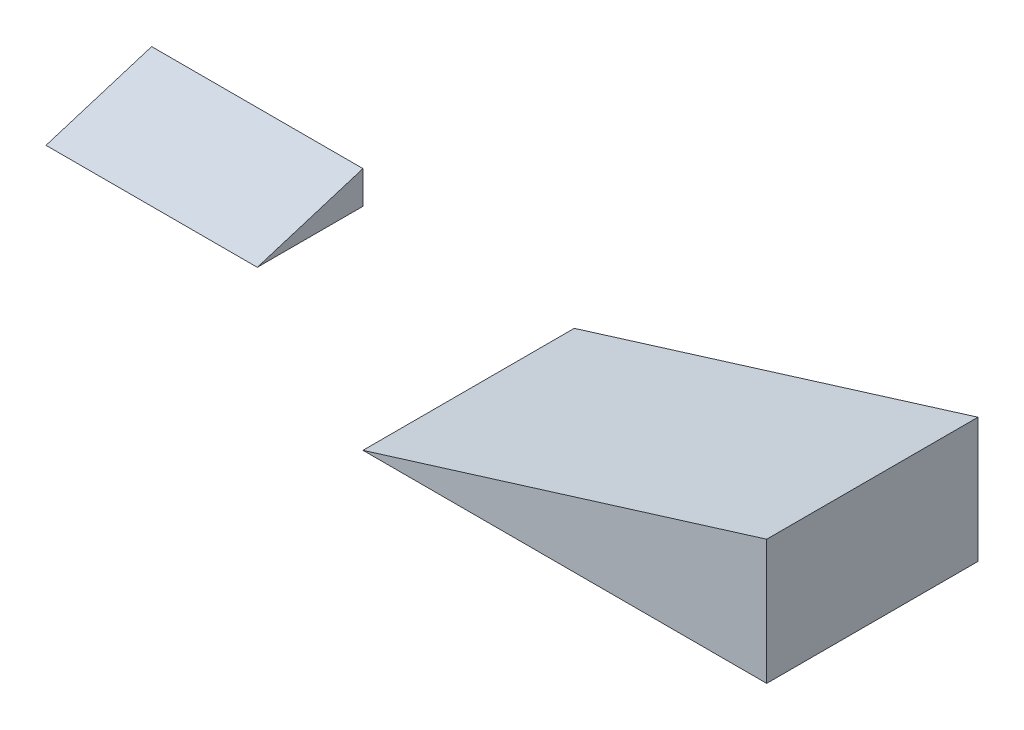
ISO-10303-21;
HEADER;
FILE_DESCRIPTION(('STEP AP214'),'2;1');
FILE_NAME('part.step','',(''),(''),'','','');
FILE_SCHEMA(('AUTOMOTIVE_DESIGN { 1 0 10303 214 1 1 1 1 }'));
ENDSEC;
DATA;
#1=APPLICATION_CONTEXT('core data for automotive mechanical design processes');
#2=APPLICATION_PROTOCOL_DEFINITION('international standard','automotive_design',2000,#1);
#3=PRODUCT_CONTEXT('',#1,'mechanical');
#4=PRODUCT('Part','Part','',(#3));
#5=PRODUCT_RELATED_PRODUCT_CATEGORY('part','',(#4));
#6=PRODUCT_DEFINITION_FORMATION('','',#4);
#7=PRODUCT_DEFINITION_CONTEXT('part definition',#1,'design');
#8=PRODUCT_DEFINITION('design','',#6,#7);
#9=PRODUCT_DEFINITION_SHAPE('','',#8);
#10=(LENGTH_UNIT() NAMED_UNIT(*) SI_UNIT(.MILLI.,.METRE.));
#11=(NAMED_UNIT(*) PLANE_ANGLE_UNIT() SI_UNIT($,.RADIAN.));
#12=(NAMED_UNIT(*) SI_UNIT($,.STERADIAN.) SOLID_ANGLE_UNIT());
#13=UNCERTAINTY_MEASURE_WITH_UNIT(LENGTH_MEASURE(1.E-05),#10,'distance_accuracy_value','');
#14=(GEOMETRIC_REPRESENTATION_CONTEXT(3) GLOBAL_UNCERTAINTY_ASSIGNED_CONTEXT((#13)) GLOBAL_UNIT_ASSIGNED_CONTEXT((#10,
#11,#12)) REPRESENTATION_CONTEXT('',''));
#15=CARTESIAN_POINT('',(0.,0.,0.));
#16=DIRECTION('',(0.,0.,1.));
#17=DIRECTION('',(1.,0.,0.));
#18=AXIS2_PLACEMENT_3D('',#15,#16,#17);
#19=CARTESIAN_POINT('',(50.,0.,0.));
#20=DIRECTION('',(0.,0.,1.));
#21=DIRECTION('',(0.,-1.,0.));
#22=AXIS2_PLACEMENT_3D('',#19,#20,#21);
#23=PLANE('',#22);
#24=DIRECTION('',(0.,1.,0.));
#25=VECTOR('',#24,1.);
#26=CARTESIAN_POINT('',(0.,0.,0.));
#27=LINE('',#26,#25);
#28=CARTESIAN_POINT('',(0.,0.,0.));
#29=VERTEX_POINT('',#28);
#30=CARTESIAN_POINT('',(0.,7.73340624024058,0.));
#31=VERTEX_POINT('',#30);
#32=EDGE_CURVE('E93',#29,#31,#27,.T.);
#33=ORIENTED_EDGE('',*,*,#32,.T.);
#34=DIRECTION('',(-1.,0.,0.));
#35=VECTOR('',#34,1.);
#36=CARTESIAN_POINT('',(50.,7.73340624024058,0.));
#37=LINE('',#36,#35);
#38=CARTESIAN_POINT('',(50.,7.73340624024058,0.));
#39=VERTEX_POINT('',#38);
#40=EDGE_CURVE('E12',#39,#31,#37,.T.);
#41=ORIENTED_EDGE('',*,*,#40,.F.);
#42=DIRECTION('',(0.,1.,0.));
#43=VECTOR('',#42,1.);
#44=CARTESIAN_POINT('',(50.,0.,0.));
#45=LINE('',#44,#43);
#46=CARTESIAN_POINT('',(50.,0.,0.));
#47=VERTEX_POINT('',#46);
#48=EDGE_CURVE('E88',#47,#39,#45,.T.);
#49=ORIENTED_EDGE('',*,*,#48,.F.);
#50=DIRECTION('',(-1.,0.,0.));
#51=VECTOR('',#50,1.);
#52=CARTESIAN_POINT('',(50.,0.,0.));
#53=LINE('',#52,#51);
#54=EDGE_CURVE('E63',#47,#29,#53,.T.);
#55=ORIENTED_EDGE('',*,*,#54,.T.);
#56=EDGE_LOOP('',(#33,#41,#49,#55));
#57=FACE_BOUND('',#56,.T.);
#58=ADVANCED_FACE('F47',(#57),#23,.F.);
#59=CARTESIAN_POINT('',(50.,7.73340624024058,0.));
#60=DIRECTION('',(0.,-0.955336489125606,-0.29552020666134));
#61=DIRECTION('',(0.,0.29552020666134,-0.955336489125606));
#62=AXIS2_PLACEMENT_3D('',#59,#60,#61);
#63=PLANE('',#62);
#64=DIRECTION('',(0.,-0.29552020666134,0.955336489125606));
#65=VECTOR('',#64,1.);
#66=CARTESIAN_POINT('',(0.,7.73340624024058,0.));
#67=LINE('',#66,#65);
#68=CARTESIAN_POINT('',(0.,0.,25.));
#69=VERTEX_POINT('',#68);
#70=EDGE_CURVE('E96',#31,#69,#67,.T.);
#71=ORIENTED_EDGE('',*,*,#70,.T.);
#72=DIRECTION('',(-1.,0.,0.));
#73=VECTOR('',#72,1.);
#74=CARTESIAN_POINT('',(50.,0.,25.));
#75=LINE('',#74,#73);
#76=CARTESIAN_POINT('',(50.,0.,25.));
#77=VERTEX_POINT('',#76);
#78=EDGE_CURVE('E55',#77,#69,#75,.T.);
#79=ORIENTED_EDGE('',*,*,#78,.F.);
#80=DIRECTION('',(0.,-0.29552020666134,0.955336489125606));
#81=VECTOR('',#80,1.);
#82=CARTESIAN_POINT('',(50.,7.73340624024058,0.));
#83=LINE('',#82,#81);
#84=EDGE_CURVE('E81',#39,#77,#83,.T.);
#85=ORIENTED_EDGE('',*,*,#84,.F.);
#86=ORIENTED_EDGE('',*,*,#40,.T.);
#87=EDGE_LOOP('',(#71,#79,#85,#86));
#88=FACE_BOUND('',#87,.T.);
#89=ADVANCED_FACE('F83',(#88),#63,.F.);
#90=CARTESIAN_POINT('',(50.,0.,0.));
#91=DIRECTION('',(0.,-1.,0.));
#92=DIRECTION('',(0.,0.,-1.));
#93=AXIS2_PLACEMENT_3D('',#90,#91,#92);
#94=PLANE('',#93);
#95=DIRECTION('',(0.,0.,1.));
#96=VECTOR('',#95,1.);
#97=CARTESIAN_POINT('',(0.,0.,0.));
#98=LINE('',#97,#96);
#99=EDGE_CURVE('E91',#29,#69,#98,.T.);
#100=ORIENTED_EDGE('',*,*,#99,.F.);
#101=ORIENTED_EDGE('',*,*,#54,.F.);
#102=DIRECTION('',(0.,0.,1.));
#103=VECTOR('',#102,1.);
#104=CARTESIAN_POINT('',(50.,0.,0.));
#105=LINE('',#104,#103);
#106=EDGE_CURVE('E87',#47,#77,#105,.T.);
#107=ORIENTED_EDGE('',*,*,#106,.T.);
#108=ORIENTED_EDGE('',*,*,#78,.T.);
#109=EDGE_LOOP('',(#100,#101,#107,#108));
#110=FACE_BOUND('',#109,.T.);
#111=ADVANCED_FACE('F102',(#110),#94,.T.);
#112=CARTESIAN_POINT('',(50.,0.,0.));
#113=DIRECTION('',(1.,0.,0.));
#114=DIRECTION('',(0.,0.,-1.));
#115=AXIS2_PLACEMENT_3D('',#112,#113,#114);
#116=PLANE('',#115);
#117=ORIENTED_EDGE('',*,*,#48,.T.);
#118=ORIENTED_EDGE('',*,*,#84,.T.);
#119=ORIENTED_EDGE('',*,*,#106,.F.);
#120=EDGE_LOOP('',(#117,#118,#119));
#121=FACE_BOUND('',#120,.T.);
#122=ADVANCED_FACE('F90',(#121),#116,.T.);
#123=CARTESIAN_POINT('',(0.,0.,0.));
#124=DIRECTION('',(1.,0.,0.));
#125=DIRECTION('',(0.,0.,-1.));
#126=AXIS2_PLACEMENT_3D('',#123,#124,#125);
#127=PLANE('',#126);
#128=ORIENTED_EDGE('',*,*,#32,.F.);
#129=ORIENTED_EDGE('',*,*,#99,.T.);
#130=ORIENTED_EDGE('',*,*,#70,.F.);
#131=EDGE_LOOP('',(#128,#129,#130));
#132=FACE_BOUND('',#131,.T.);
#133=ADVANCED_FACE('F109',(#132),#127,.F.);
#134=CLOSED_SHELL('',(#58,#89,#111,#122,#133));
#135=MANIFOLD_SOLID_BREP('B2',#134);
#136=CARTESIAN_POINT('',(195.533648912561,29.5520206661333,50.));
#137=DIRECTION('',(1.,0.,0.));
#138=DIRECTION('',(0.,1.,0.));
#139=AXIS2_PLACEMENT_3D('',#136,#137,#138);
#140=PLANE('',#139);
#141=DIRECTION('',(0.,-1.,0.));
#142=VECTOR('',#141,1.);
#143=CARTESIAN_POINT('',(195.533648912561,29.5520206661333,0.));
#144=LINE('',#143,#142);
#145=CARTESIAN_POINT('',(195.533648912561,29.5520206661333,0.));
#146=VERTEX_POINT('',#145);
#147=CARTESIAN_POINT('',(195.533648912561,0.,0.));
#148=VERTEX_POINT('',#147);
#149=EDGE_CURVE('E197',#146,#148,#144,.T.);
#150=ORIENTED_EDGE('',*,*,#149,.F.);
#151=DIRECTION('',(0.,0.,-1.));
#152=VECTOR('',#151,1.);
#153=CARTESIAN_POINT('',(195.533648912561,29.5520206661333,50.));
#154=LINE('',#153,#152);
#155=CARTESIAN_POINT('',(195.533648912561,29.5520206661333,50.));
#156=VERTEX_POINT('',#155);
#157=EDGE_CURVE('E45',#156,#146,#154,.T.);
#158=ORIENTED_EDGE('',*,*,#157,.F.);
#159=DIRECTION('',(0.,-1.,0.));
#160=VECTOR('',#159,1.);
#161=CARTESIAN_POINT('',(195.533648912561,29.5520206661333,50.));
#162=LINE('',#161,#160);
#163=CARTESIAN_POINT('',(195.533648912561,0.,50.));
#164=VERTEX_POINT('',#163);
#165=EDGE_CURVE('E184',#156,#164,#162,.T.);
#166=ORIENTED_EDGE('',*,*,#165,.T.);
#167=DIRECTION('',(0.,0.,-1.));
#168=VECTOR('',#167,1.);
#169=CARTESIAN_POINT('',(195.533648912561,0.,50.));
#170=LINE('',#169,#168);
#171=EDGE_CURVE('E148',#164,#148,#170,.T.);
#172=ORIENTED_EDGE('',*,*,#171,.T.);
#173=EDGE_LOOP('',(#150,#158,#166,#172));
#174=FACE_BOUND('',#173,.T.);
#175=ADVANCED_FACE('F145',(#174),#140,.T.);
#176=CARTESIAN_POINT('',(195.533648912561,29.5520206661333,50.));
#177=DIRECTION('',(0.295520206661333,-0.955336489125608,0.));
#178=DIRECTION('',(0.955336489125608,0.295520206661333,0.));
#179=AXIS2_PLACEMENT_3D('',#176,#177,#178);
#180=PLANE('',#179);
#181=DIRECTION('',(-0.955336489125608,-0.295520206661333,0.));
#182=VECTOR('',#181,1.);
#183=CARTESIAN_POINT('',(195.533648912561,29.5520206661333,0.));
#184=LINE('',#183,#182);
#185=CARTESIAN_POINT('',(100.,0.,0.));
#186=VERTEX_POINT('',#185);
#187=EDGE_CURVE('E175',#146,#186,#184,.T.);
#188=ORIENTED_EDGE('',*,*,#187,.T.);
#189=DIRECTION('',(0.,0.,-1.));
#190=VECTOR('',#189,1.);
#191=CARTESIAN_POINT('',(100.,0.,50.));
#192=LINE('',#191,#190);
#193=CARTESIAN_POINT('',(100.,0.,50.));
#194=VERTEX_POINT('',#193);
#195=EDGE_CURVE('E154',#194,#186,#192,.T.);
#196=ORIENTED_EDGE('',*,*,#195,.F.);
#197=DIRECTION('',(-0.955336489125608,-0.295520206661333,0.));
#198=VECTOR('',#197,1.);
#199=CARTESIAN_POINT('',(195.533648912561,29.5520206661333,50.));
#200=LINE('',#199,#198);
#201=EDGE_CURVE('E185',#156,#194,#200,.T.);
#202=ORIENTED_EDGE('',*,*,#201,.F.);
#203=ORIENTED_EDGE('',*,*,#157,.T.);
#204=EDGE_LOOP('',(#188,#196,#202,#203));
#205=FACE_BOUND('',#204,.T.);
#206=ADVANCED_FACE('F209',(#205),#180,.F.);
#207=CARTESIAN_POINT('',(100.,0.,50.));
#208=DIRECTION('',(0.,1.,0.));
#209=DIRECTION('',(-1.,0.,0.));
#210=AXIS2_PLACEMENT_3D('',#207,#208,#209);
#211=PLANE('',#210);
#212=DIRECTION('',(1.,0.,0.));
#213=VECTOR('',#212,1.);
#214=CARTESIAN_POINT('',(100.,0.,0.));
#215=LINE('',#214,#213);
#216=EDGE_CURVE('E191',#186,#148,#215,.T.);
#217=ORIENTED_EDGE('',*,*,#216,.T.);
#218=ORIENTED_EDGE('',*,*,#171,.F.);
#219=DIRECTION('',(1.,0.,0.));
#220=VECTOR('',#219,1.);
#221=CARTESIAN_POINT('',(100.,0.,50.));
#222=LINE('',#221,#220);
#223=EDGE_CURVE('E181',#194,#164,#222,.T.);
#224=ORIENTED_EDGE('',*,*,#223,.F.);
#225=ORIENTED_EDGE('',*,*,#195,.T.);
#226=EDGE_LOOP('',(#217,#218,#224,#225));
#227=FACE_BOUND('',#226,.T.);
#228=ADVANCED_FACE('F189',(#227),#211,.F.);
#229=CARTESIAN_POINT('',(0.,0.,50.));
#230=DIRECTION('',(0.,0.,1.));
#231=DIRECTION('',(1.,0.,0.));
#232=AXIS2_PLACEMENT_3D('',#229,#230,#231);
#233=PLANE('',#232);
#234=ORIENTED_EDGE('',*,*,#165,.F.);
#235=ORIENTED_EDGE('',*,*,#201,.T.);
#236=ORIENTED_EDGE('',*,*,#223,.T.);
#237=EDGE_LOOP('',(#234,#235,#236));
#238=FACE_BOUND('',#237,.T.);
#239=ADVANCED_FACE('F183',(#238),#233,.T.);
#240=CARTESIAN_POINT('',(0.,0.,0.));
#241=DIRECTION('',(0.,0.,1.));
#242=DIRECTION('',(1.,0.,0.));
#243=AXIS2_PLACEMENT_3D('',#240,#241,#242);
#244=PLANE('',#243);
#245=ORIENTED_EDGE('',*,*,#149,.T.);
#246=ORIENTED_EDGE('',*,*,#216,.F.);
#247=ORIENTED_EDGE('',*,*,#187,.F.);
#248=EDGE_LOOP('',(#245,#246,#247));
#249=FACE_BOUND('',#248,.T.);
#250=ADVANCED_FACE('F200',(#249),#244,.F.);
#251=CLOSED_SHELL('',(#175,#206,#228,#239,#250));
#252=MANIFOLD_SOLID_BREP('B6',#251);
#253=ADVANCED_BREP_SHAPE_REPRESENTATION('',(#18,#135,#252),#14);
#254=SHAPE_DEFINITION_REPRESENTATION(#9,#253);
ENDSEC;
END-ISO-10303-21;
